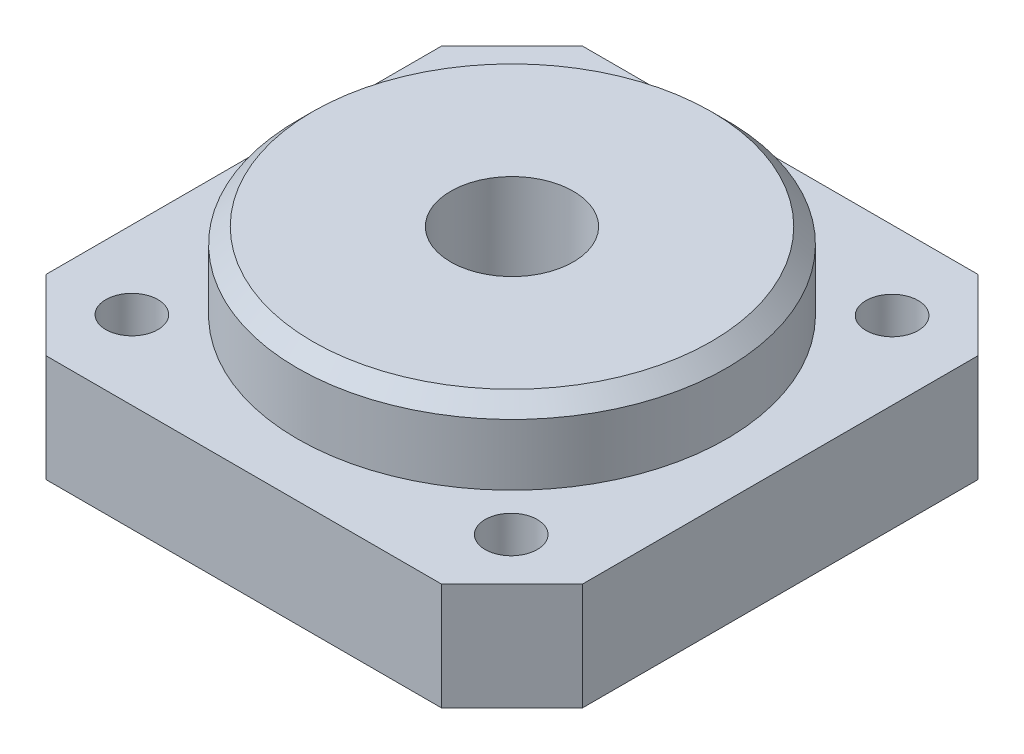
ISO-10303-21;
HEADER;
FILE_DESCRIPTION(('STEP AP214'),'2;1');
FILE_NAME('part.step','',(''),(''),'','','');
FILE_SCHEMA(('AUTOMOTIVE_DESIGN { 1 0 10303 214 1 1 1 1 }'));
ENDSEC;
DATA;
#1=APPLICATION_CONTEXT('core data for automotive mechanical design processes');
#2=APPLICATION_PROTOCOL_DEFINITION('international standard','automotive_design',2000,#1);
#3=PRODUCT_CONTEXT('',#1,'mechanical');
#4=PRODUCT('Part','Part','',(#3));
#5=PRODUCT_RELATED_PRODUCT_CATEGORY('part','',(#4));
#6=PRODUCT_DEFINITION_FORMATION('','',#4);
#7=PRODUCT_DEFINITION_CONTEXT('part definition',#1,'design');
#8=PRODUCT_DEFINITION('design','',#6,#7);
#9=PRODUCT_DEFINITION_SHAPE('','',#8);
#10=(LENGTH_UNIT() NAMED_UNIT(*) SI_UNIT(.MILLI.,.METRE.));
#11=(NAMED_UNIT(*) PLANE_ANGLE_UNIT() SI_UNIT($,.RADIAN.));
#12=(NAMED_UNIT(*) SI_UNIT($,.STERADIAN.) SOLID_ANGLE_UNIT());
#13=UNCERTAINTY_MEASURE_WITH_UNIT(LENGTH_MEASURE(1.E-05),#10,'distance_accuracy_value','');
#14=(GEOMETRIC_REPRESENTATION_CONTEXT(3) GLOBAL_UNCERTAINTY_ASSIGNED_CONTEXT((#13)) GLOBAL_UNIT_ASSIGNED_CONTEXT((#10,
#11,#12)) REPRESENTATION_CONTEXT('',''));
#15=CARTESIAN_POINT('',(0.,0.,0.));
#16=DIRECTION('',(0.,0.,1.));
#17=DIRECTION('',(1.,0.,0.));
#18=AXIS2_PLACEMENT_3D('',#15,#16,#17);
#19=CARTESIAN_POINT('',(12.4269184653541,7.,-12.3743686707646));
#20=DIRECTION('',(0.,-1.,0.));
#21=DIRECTION('',(0.,0.,-1.));
#22=AXIS2_PLACEMENT_3D('',#19,#20,#21);
#23=CYLINDRICAL_SURFACE('',#22,1.7);
#24=CARTESIAN_POINT('',(12.4269184653541,7.,-12.3743686707646));
#25=DIRECTION('',(0.,1.,0.));
#26=DIRECTION('',(0.,0.,1.));
#27=AXIS2_PLACEMENT_3D('',#24,#25,#26);
#28=CIRCLE('',#27,1.7);
#29=CARTESIAN_POINT('',(12.4269184653541,7.,-10.6743686707646));
#30=VERTEX_POINT('',#29);
#31=EDGE_CURVE('E140',#30,#30,#28,.T.);
#32=ORIENTED_EDGE('',*,*,#31,.T.);
#33=EDGE_LOOP('',(#32));
#34=FACE_BOUND('',#33,.T.);
#35=CARTESIAN_POINT('',(12.4269184653541,4.,-12.3743686707646));
#36=DIRECTION('',(0.,-1.,0.));
#37=DIRECTION('',(0.,0.,-1.));
#38=AXIS2_PLACEMENT_3D('',#35,#36,#37);
#39=CIRCLE('',#38,1.7);
#40=CARTESIAN_POINT('',(12.4269184653541,4.,-14.0743686707646));
#41=VERTEX_POINT('',#40);
#42=EDGE_CURVE('E177',#41,#41,#39,.T.);
#43=ORIENTED_EDGE('',*,*,#42,.T.);
#44=EDGE_LOOP('',(#43));
#45=FACE_BOUND('',#44,.T.);
#46=ADVANCED_FACE('F33',(#34,#45),#23,.F.);
#47=CARTESIAN_POINT('',(12.3743686707646,7.,12.4269184653541));
#48=DIRECTION('',(0.,-1.,0.));
#49=DIRECTION('',(0.,0.,-1.));
#50=AXIS2_PLACEMENT_3D('',#47,#48,#49);
#51=CYLINDRICAL_SURFACE('',#50,1.70000000000002);
#52=CARTESIAN_POINT('',(12.3743686707646,7.,12.4269184653541));
#53=DIRECTION('',(0.,1.,0.));
#54=DIRECTION('',(0.,0.,1.));
#55=AXIS2_PLACEMENT_3D('',#52,#53,#54);
#56=CIRCLE('',#55,1.70000000000002);
#57=CARTESIAN_POINT('',(12.3743686707646,7.,14.1269184653541));
#58=VERTEX_POINT('',#57);
#59=EDGE_CURVE('E197',#58,#58,#56,.T.);
#60=ORIENTED_EDGE('',*,*,#59,.T.);
#61=EDGE_LOOP('',(#60));
#62=FACE_BOUND('',#61,.T.);
#63=CARTESIAN_POINT('',(12.3743686707646,4.,12.4269184653541));
#64=DIRECTION('',(0.,-1.,0.));
#65=DIRECTION('',(0.,0.,-1.));
#66=AXIS2_PLACEMENT_3D('',#63,#64,#65);
#67=CIRCLE('',#66,1.70000000000002);
#68=CARTESIAN_POINT('',(12.3743686707646,4.,10.7269184653541));
#69=VERTEX_POINT('',#68);
#70=EDGE_CURVE('E174',#69,#69,#67,.T.);
#71=ORIENTED_EDGE('',*,*,#70,.T.);
#72=EDGE_LOOP('',(#71));
#73=FACE_BOUND('',#72,.T.);
#74=ADVANCED_FACE('F233',(#62,#73),#51,.F.);
#75=CARTESIAN_POINT('',(-12.4269184653541,7.,12.3743686707646));
#76=DIRECTION('',(0.,-1.,0.));
#77=DIRECTION('',(0.,0.,-1.));
#78=AXIS2_PLACEMENT_3D('',#75,#76,#77);
#79=CYLINDRICAL_SURFACE('',#78,1.70000000000005);
#80=CARTESIAN_POINT('',(-12.4269184653541,7.,12.3743686707646));
#81=DIRECTION('',(0.,1.,0.));
#82=DIRECTION('',(0.,0.,1.));
#83=AXIS2_PLACEMENT_3D('',#80,#81,#82);
#84=CIRCLE('',#83,1.70000000000005);
#85=CARTESIAN_POINT('',(-12.4269184653541,7.,14.0743686707646));
#86=VERTEX_POINT('',#85);
#87=EDGE_CURVE('E193',#86,#86,#84,.T.);
#88=ORIENTED_EDGE('',*,*,#87,.T.);
#89=EDGE_LOOP('',(#88));
#90=FACE_BOUND('',#89,.T.);
#91=CARTESIAN_POINT('',(-12.4269184653541,4.,12.3743686707646));
#92=DIRECTION('',(0.,-1.,0.));
#93=DIRECTION('',(0.,0.,-1.));
#94=AXIS2_PLACEMENT_3D('',#91,#92,#93);
#95=CIRCLE('',#94,1.70000000000005);
#96=CARTESIAN_POINT('',(-12.4269184653541,4.,10.6743686707645));
#97=VERTEX_POINT('',#96);
#98=EDGE_CURVE('E170',#97,#97,#95,.T.);
#99=ORIENTED_EDGE('',*,*,#98,.T.);
#100=EDGE_LOOP('',(#99));
#101=FACE_BOUND('',#100,.T.);
#102=ADVANCED_FACE('F239',(#90,#101),#79,.F.);
#103=CARTESIAN_POINT('',(-12.3743686707646,7.,-12.4269184653541));
#104=DIRECTION('',(0.,-1.,0.));
#105=DIRECTION('',(0.,0.,-1.));
#106=AXIS2_PLACEMENT_3D('',#103,#104,#105);
#107=CYLINDRICAL_SURFACE('',#106,1.70000000000009);
#108=CARTESIAN_POINT('',(-12.3743686707646,7.,-12.4269184653541));
#109=DIRECTION('',(0.,1.,0.));
#110=DIRECTION('',(0.,0.,1.));
#111=AXIS2_PLACEMENT_3D('',#108,#109,#110);
#112=CIRCLE('',#111,1.70000000000009);
#113=CARTESIAN_POINT('',(-12.3743686707646,7.,-10.726918465354));
#114=VERTEX_POINT('',#113);
#115=EDGE_CURVE('E190',#114,#114,#112,.T.);
#116=ORIENTED_EDGE('',*,*,#115,.T.);
#117=EDGE_LOOP('',(#116));
#118=FACE_BOUND('',#117,.T.);
#119=CARTESIAN_POINT('',(-12.3743686707646,4.,-12.4269184653541));
#120=DIRECTION('',(0.,-1.,0.));
#121=DIRECTION('',(0.,0.,-1.));
#122=AXIS2_PLACEMENT_3D('',#119,#120,#121);
#123=CIRCLE('',#122,1.70000000000009);
#124=CARTESIAN_POINT('',(-12.3743686707646,4.,-14.1269184653542));
#125=VERTEX_POINT('',#124);
#126=EDGE_CURVE('E167',#125,#125,#123,.T.);
#127=ORIENTED_EDGE('',*,*,#126,.T.);
#128=EDGE_LOOP('',(#127));
#129=FACE_BOUND('',#128,.T.);
#130=ADVANCED_FACE('F247',(#118,#129),#107,.F.);
#131=CARTESIAN_POINT('',(0.,7.,0.));
#132=DIRECTION('',(0.,-1.,0.));
#133=DIRECTION('',(0.,0.,-1.));
#134=AXIS2_PLACEMENT_3D('',#131,#132,#133);
#135=PLANE('',#134);
#136=CARTESIAN_POINT('',(0.,7.,0.));
#137=DIRECTION('',(0.,1.,0.));
#138=DIRECTION('',(0.,0.,1.));
#139=AXIS2_PLACEMENT_3D('',#136,#137,#138);
#140=CIRCLE('',#139,14.);
#141=CARTESIAN_POINT('',(0.,7.,14.));
#142=VERTEX_POINT('',#141);
#143=EDGE_CURVE('E166',#142,#142,#140,.T.);
#144=ORIENTED_EDGE('',*,*,#143,.F.);
#145=EDGE_LOOP('',(#144));
#146=FACE_BOUND('',#145,.T.);
#147=DIRECTION('',(-1.,0.,0.));
#148=VECTOR('',#147,1.);
#149=CARTESIAN_POINT('',(-12.9055915910216,7.,-17.5));
#150=LINE('',#149,#148);
#151=CARTESIAN_POINT('',(12.9055915910215,7.,-17.5));
#152=VERTEX_POINT('',#151);
#153=CARTESIAN_POINT('',(-12.9055915910216,7.,-17.5));
#154=VERTEX_POINT('',#153);
#155=EDGE_CURVE('E50',#152,#154,#150,.T.);
#156=ORIENTED_EDGE('',*,*,#155,.T.);
#157=DIRECTION('',(-0.707106781186546,0.,0.707106781186549));
#158=VECTOR('',#157,1.);
#159=CARTESIAN_POINT('',(-17.5,7.,-12.9055915910215));
#160=LINE('',#159,#158);
#161=CARTESIAN_POINT('',(-17.5,7.,-12.9055915910215));
#162=VERTEX_POINT('',#161);
#163=EDGE_CURVE('E94',#154,#162,#160,.T.);
#164=ORIENTED_EDGE('',*,*,#163,.T.);
#165=DIRECTION('',(0.,0.,1.));
#166=VECTOR('',#165,1.);
#167=CARTESIAN_POINT('',(-17.5,7.,0.));
#168=LINE('',#167,#166);
#169=CARTESIAN_POINT('',(-17.5,7.,12.9055915910216));
#170=VERTEX_POINT('',#169);
#171=EDGE_CURVE('E204',#162,#170,#168,.T.);
#172=ORIENTED_EDGE('',*,*,#171,.T.);
#173=DIRECTION('',(0.707106781186549,0.,0.707106781186546));
#174=VECTOR('',#173,1.);
#175=CARTESIAN_POINT('',(-12.9055915910215,7.,17.5));
#176=LINE('',#175,#174);
#177=CARTESIAN_POINT('',(-12.9055915910215,7.,17.5));
#178=VERTEX_POINT('',#177);
#179=EDGE_CURVE('E206',#170,#178,#176,.T.);
#180=ORIENTED_EDGE('',*,*,#179,.T.);
#181=DIRECTION('',(1.,0.,0.));
#182=VECTOR('',#181,1.);
#183=CARTESIAN_POINT('',(0.,7.,17.5));
#184=LINE('',#183,#182);
#185=CARTESIAN_POINT('',(12.9055915910216,7.,17.5));
#186=VERTEX_POINT('',#185);
#187=EDGE_CURVE('E115',#178,#186,#184,.T.);
#188=ORIENTED_EDGE('',*,*,#187,.T.);
#189=DIRECTION('',(0.707106781186546,0.,-0.707106781186549));
#190=VECTOR('',#189,1.);
#191=CARTESIAN_POINT('',(17.5,7.,12.9055915910215));
#192=LINE('',#191,#190);
#193=CARTESIAN_POINT('',(17.5,7.,12.9055915910215));
#194=VERTEX_POINT('',#193);
#195=EDGE_CURVE('E108',#186,#194,#192,.T.);
#196=ORIENTED_EDGE('',*,*,#195,.T.);
#197=DIRECTION('',(0.,0.,-1.));
#198=VECTOR('',#197,1.);
#199=CARTESIAN_POINT('',(17.5,7.,0.));
#200=LINE('',#199,#198);
#201=CARTESIAN_POINT('',(17.5,7.,-12.9055915910215));
#202=VERTEX_POINT('',#201);
#203=EDGE_CURVE('E113',#194,#202,#200,.T.);
#204=ORIENTED_EDGE('',*,*,#203,.T.);
#205=DIRECTION('',(-0.707106781186549,0.,-0.707106781186546));
#206=VECTOR('',#205,1.);
#207=CARTESIAN_POINT('',(12.9055915910215,7.,-17.5));
#208=LINE('',#207,#206);
#209=EDGE_CURVE('E130',#202,#152,#208,.T.);
#210=ORIENTED_EDGE('',*,*,#209,.T.);
#211=EDGE_LOOP('',(#156,#164,#172,#180,#188,#196,#204,#210));
#212=FACE_BOUND('',#211,.T.);
#213=ORIENTED_EDGE('',*,*,#31,.F.);
#214=EDGE_LOOP('',(#213));
#215=FACE_BOUND('',#214,.T.);
#216=ORIENTED_EDGE('',*,*,#59,.F.);
#217=EDGE_LOOP('',(#216));
#218=FACE_BOUND('',#217,.T.);
#219=ORIENTED_EDGE('',*,*,#87,.F.);
#220=EDGE_LOOP('',(#219));
#221=FACE_BOUND('',#220,.T.);
#222=ORIENTED_EDGE('',*,*,#115,.F.);
#223=EDGE_LOOP('',(#222));
#224=FACE_BOUND('',#223,.T.);
#225=ADVANCED_FACE('F110',(#146,#212,#215,#218,#221,#224),#135,.F.);
#226=CARTESIAN_POINT('',(0.,0.,0.));
#227=DIRECTION('',(0.,-1.,0.));
#228=DIRECTION('',(0.,0.,-1.));
#229=AXIS2_PLACEMENT_3D('',#226,#227,#228);
#230=PLANE('',#229);
#231=CARTESIAN_POINT('',(-12.3743686707639,0.,-12.4269184653541));
#232=DIRECTION('',(0.,-1.,0.));
#233=DIRECTION('',(0.,0.,-1.));
#234=AXIS2_PLACEMENT_3D('',#231,#232,#233);
#235=CIRCLE('',#234,3.25000000000037);
#236=CARTESIAN_POINT('',(-12.3743686707639,0.,-15.6769184653544));
#237=VERTEX_POINT('',#236);
#238=EDGE_CURVE('E483',#237,#237,#235,.T.);
#239=ORIENTED_EDGE('',*,*,#238,.F.);
#240=EDGE_LOOP('',(#239));
#241=FACE_BOUND('',#240,.T.);
#242=CARTESIAN_POINT('',(12.4269184653548,0.,-12.3743686707639));
#243=DIRECTION('',(0.,-1.,0.));
#244=DIRECTION('',(0.,0.,-1.));
#245=AXIS2_PLACEMENT_3D('',#242,#243,#244);
#246=CIRCLE('',#245,3.250000000001);
#247=CARTESIAN_POINT('',(12.4269184653548,0.,-15.6243686707649));
#248=VERTEX_POINT('',#247);
#249=EDGE_CURVE('E482',#248,#248,#246,.T.);
#250=ORIENTED_EDGE('',*,*,#249,.F.);
#251=EDGE_LOOP('',(#250));
#252=FACE_BOUND('',#251,.T.);
#253=CARTESIAN_POINT('',(12.3743686707646,0.,12.4269184653548));
#254=DIRECTION('',(0.,-1.,0.));
#255=DIRECTION('',(0.,0.,-1.));
#256=AXIS2_PLACEMENT_3D('',#253,#254,#255);
#257=CIRCLE('',#256,3.25000000000073);
#258=CARTESIAN_POINT('',(12.3743686707646,0.,9.17691846535405));
#259=VERTEX_POINT('',#258);
#260=EDGE_CURVE('E507',#259,#259,#257,.T.);
#261=ORIENTED_EDGE('',*,*,#260,.F.);
#262=EDGE_LOOP('',(#261));
#263=FACE_BOUND('',#262,.T.);
#264=CARTESIAN_POINT('',(-12.4269184653541,0.,12.3743686707646));
#265=DIRECTION('',(0.,-1.,0.));
#266=DIRECTION('',(0.,0.,-1.));
#267=AXIS2_PLACEMENT_3D('',#264,#265,#266);
#268=CIRCLE('',#267,3.25);
#269=CARTESIAN_POINT('',(-12.4269184653541,0.,9.12436867076459));
#270=VERTEX_POINT('',#269);
#271=EDGE_CURVE('E494',#270,#270,#268,.T.);
#272=ORIENTED_EDGE('',*,*,#271,.F.);
#273=EDGE_LOOP('',(#272));
#274=FACE_BOUND('',#273,.T.);
#275=CARTESIAN_POINT('',(0.,0.,0.));
#276=DIRECTION('',(0.,-1.,0.));
#277=DIRECTION('',(0.,0.,-1.));
#278=AXIS2_PLACEMENT_3D('',#275,#276,#277);
#279=CIRCLE('',#278,4.);
#280=CARTESIAN_POINT('',(0.,0.,-4.));
#281=VERTEX_POINT('',#280);
#282=EDGE_CURVE('E179',#281,#281,#279,.F.);
#283=ORIENTED_EDGE('',*,*,#282,.T.);
#284=EDGE_LOOP('',(#283));
#285=FACE_BOUND('',#284,.T.);
#286=DIRECTION('',(-0.707106781186546,0.,0.707106781186549));
#287=VECTOR('',#286,1.);
#288=CARTESIAN_POINT('',(-17.5,0.,-12.9055915910215));
#289=LINE('',#288,#287);
#290=CARTESIAN_POINT('',(-12.9055915910216,0.,-17.5));
#291=VERTEX_POINT('',#290);
#292=CARTESIAN_POINT('',(-17.5,0.,-12.9055915910215));
#293=VERTEX_POINT('',#292);
#294=EDGE_CURVE('E136',#291,#293,#289,.T.);
#295=ORIENTED_EDGE('',*,*,#294,.F.);
#296=DIRECTION('',(-1.,0.,0.));
#297=VECTOR('',#296,1.);
#298=CARTESIAN_POINT('',(0.,0.,-17.5));
#299=LINE('',#298,#297);
#300=CARTESIAN_POINT('',(12.9055915910215,0.,-17.5));
#301=VERTEX_POINT('',#300);
#302=EDGE_CURVE('E150',#301,#291,#299,.T.);
#303=ORIENTED_EDGE('',*,*,#302,.F.);
#304=DIRECTION('',(-0.707106781186549,0.,-0.707106781186546));
#305=VECTOR('',#304,1.);
#306=CARTESIAN_POINT('',(12.9055915910215,0.,-17.5));
#307=LINE('',#306,#305);
#308=CARTESIAN_POINT('',(17.5,0.,-12.9055915910215));
#309=VERTEX_POINT('',#308);
#310=EDGE_CURVE('E86',#309,#301,#307,.T.);
#311=ORIENTED_EDGE('',*,*,#310,.F.);
#312=DIRECTION('',(0.,0.,-1.));
#313=VECTOR('',#312,1.);
#314=CARTESIAN_POINT('',(17.5,0.,-12.9055915910215));
#315=LINE('',#314,#313);
#316=CARTESIAN_POINT('',(17.5,0.,12.9055915910215));
#317=VERTEX_POINT('',#316);
#318=EDGE_CURVE('E79',#317,#309,#315,.T.);
#319=ORIENTED_EDGE('',*,*,#318,.F.);
#320=DIRECTION('',(0.707106781186546,0.,-0.707106781186549));
#321=VECTOR('',#320,1.);
#322=CARTESIAN_POINT('',(17.5,0.,12.9055915910215));
#323=LINE('',#322,#321);
#324=CARTESIAN_POINT('',(12.9055915910216,0.,17.5));
#325=VERTEX_POINT('',#324);
#326=EDGE_CURVE('E124',#325,#317,#323,.T.);
#327=ORIENTED_EDGE('',*,*,#326,.F.);
#328=DIRECTION('',(1.,0.,0.));
#329=VECTOR('',#328,1.);
#330=CARTESIAN_POINT('',(12.9055915910216,0.,17.5));
#331=LINE('',#330,#329);
#332=CARTESIAN_POINT('',(-12.9055915910215,0.,17.5));
#333=VERTEX_POINT('',#332);
#334=EDGE_CURVE('E145',#333,#325,#331,.T.);
#335=ORIENTED_EDGE('',*,*,#334,.F.);
#336=DIRECTION('',(0.707106781186549,0.,0.707106781186546));
#337=VECTOR('',#336,1.);
#338=CARTESIAN_POINT('',(-12.9055915910215,0.,17.5));
#339=LINE('',#338,#337);
#340=CARTESIAN_POINT('',(-17.5,0.,12.9055915910216));
#341=VERTEX_POINT('',#340);
#342=EDGE_CURVE('E142',#341,#333,#339,.T.);
#343=ORIENTED_EDGE('',*,*,#342,.F.);
#344=DIRECTION('',(0.,0.,1.));
#345=VECTOR('',#344,1.);
#346=CARTESIAN_POINT('',(-17.5,0.,12.9055915910216));
#347=LINE('',#346,#345);
#348=EDGE_CURVE('E139',#293,#341,#347,.T.);
#349=ORIENTED_EDGE('',*,*,#348,.F.);
#350=EDGE_LOOP('',(#295,#303,#311,#319,#327,#335,#343,#349));
#351=FACE_BOUND('',#350,.T.);
#352=ADVANCED_FACE('F218',(#241,#252,#263,#274,#285,#351),#230,.T.);
#353=CARTESIAN_POINT('',(-17.5,7.,-12.9055915910215));
#354=DIRECTION('',(0.707106781186549,0.,0.707106781186546));
#355=DIRECTION('',(0.707106781186546,0.,-0.707106781186549));
#356=AXIS2_PLACEMENT_3D('',#353,#354,#355);
#357=PLANE('',#356);
#358=ORIENTED_EDGE('',*,*,#294,.T.);
#359=DIRECTION('',(0.,-1.,0.));
#360=VECTOR('',#359,1.);
#361=CARTESIAN_POINT('',(-17.5,7.,-12.9055915910215));
#362=LINE('',#361,#360);
#363=EDGE_CURVE('E161',#162,#293,#362,.T.);
#364=ORIENTED_EDGE('',*,*,#363,.F.);
#365=ORIENTED_EDGE('',*,*,#163,.F.);
#366=DIRECTION('',(0.,-1.,0.));
#367=VECTOR('',#366,1.);
#368=CARTESIAN_POINT('',(-12.9055915910216,7.,-17.5));
#369=LINE('',#368,#367);
#370=EDGE_CURVE('E164',#154,#291,#369,.T.);
#371=ORIENTED_EDGE('',*,*,#370,.T.);
#372=EDGE_LOOP('',(#358,#364,#365,#371));
#373=FACE_BOUND('',#372,.T.);
#374=ADVANCED_FACE('F222',(#373),#357,.F.);
#375=CARTESIAN_POINT('',(-17.5,7.,12.9055915910216));
#376=DIRECTION('',(1.,0.,0.));
#377=DIRECTION('',(0.,0.,-1.));
#378=AXIS2_PLACEMENT_3D('',#375,#376,#377);
#379=PLANE('',#378);
#380=ORIENTED_EDGE('',*,*,#348,.T.);
#381=DIRECTION('',(0.,-1.,0.));
#382=VECTOR('',#381,1.);
#383=CARTESIAN_POINT('',(-17.5,7.,12.9055915910216));
#384=LINE('',#383,#382);
#385=EDGE_CURVE('E158',#170,#341,#384,.T.);
#386=ORIENTED_EDGE('',*,*,#385,.F.);
#387=ORIENTED_EDGE('',*,*,#171,.F.);
#388=ORIENTED_EDGE('',*,*,#363,.T.);
#389=EDGE_LOOP('',(#380,#386,#387,#388));
#390=FACE_BOUND('',#389,.T.);
#391=ADVANCED_FACE('F224',(#390),#379,.F.);
#392=CARTESIAN_POINT('',(-12.9055915910215,7.,17.5));
#393=DIRECTION('',(0.707106781186546,0.,-0.707106781186549));
#394=DIRECTION('',(-0.707106781186549,0.,-0.707106781186546));
#395=AXIS2_PLACEMENT_3D('',#392,#393,#394);
#396=PLANE('',#395);
#397=ORIENTED_EDGE('',*,*,#342,.T.);
#398=DIRECTION('',(0.,-1.,0.));
#399=VECTOR('',#398,1.);
#400=CARTESIAN_POINT('',(-12.9055915910215,7.,17.5));
#401=LINE('',#400,#399);
#402=EDGE_CURVE('E155',#178,#333,#401,.T.);
#403=ORIENTED_EDGE('',*,*,#402,.F.);
#404=ORIENTED_EDGE('',*,*,#179,.F.);
#405=ORIENTED_EDGE('',*,*,#385,.T.);
#406=EDGE_LOOP('',(#397,#403,#404,#405));
#407=FACE_BOUND('',#406,.T.);
#408=ADVANCED_FACE('F212',(#407),#396,.F.);
#409=CARTESIAN_POINT('',(12.9055915910216,7.,17.5));
#410=DIRECTION('',(0.,0.,-1.));
#411=DIRECTION('',(-1.,0.,0.));
#412=AXIS2_PLACEMENT_3D('',#409,#410,#411);
#413=PLANE('',#412);
#414=ORIENTED_EDGE('',*,*,#334,.T.);
#415=DIRECTION('',(0.,-1.,0.));
#416=VECTOR('',#415,1.);
#417=CARTESIAN_POINT('',(12.9055915910216,7.,17.5));
#418=LINE('',#417,#416);
#419=EDGE_CURVE('E125',#186,#325,#418,.T.);
#420=ORIENTED_EDGE('',*,*,#419,.F.);
#421=ORIENTED_EDGE('',*,*,#187,.F.);
#422=ORIENTED_EDGE('',*,*,#402,.T.);
#423=EDGE_LOOP('',(#414,#420,#421,#422));
#424=FACE_BOUND('',#423,.T.);
#425=ADVANCED_FACE('F215',(#424),#413,.F.);
#426=CARTESIAN_POINT('',(17.5,7.,12.9055915910215));
#427=DIRECTION('',(-0.707106781186549,0.,-0.707106781186546));
#428=DIRECTION('',(-0.707106781186546,0.,0.707106781186549));
#429=AXIS2_PLACEMENT_3D('',#426,#427,#428);
#430=PLANE('',#429);
#431=ORIENTED_EDGE('',*,*,#326,.T.);
#432=DIRECTION('',(0.,-1.,0.));
#433=VECTOR('',#432,1.);
#434=CARTESIAN_POINT('',(17.5,7.,12.9055915910215));
#435=LINE('',#434,#433);
#436=EDGE_CURVE('E121',#194,#317,#435,.T.);
#437=ORIENTED_EDGE('',*,*,#436,.F.);
#438=ORIENTED_EDGE('',*,*,#195,.F.);
#439=ORIENTED_EDGE('',*,*,#419,.T.);
#440=EDGE_LOOP('',(#431,#437,#438,#439));
#441=FACE_BOUND('',#440,.T.);
#442=ADVANCED_FACE('F122',(#441),#430,.F.);
#443=CARTESIAN_POINT('',(17.5,7.,-12.9055915910215));
#444=DIRECTION('',(-1.,0.,0.));
#445=DIRECTION('',(0.,0.,1.));
#446=AXIS2_PLACEMENT_3D('',#443,#444,#445);
#447=PLANE('',#446);
#448=ORIENTED_EDGE('',*,*,#318,.T.);
#449=DIRECTION('',(0.,-1.,0.));
#450=VECTOR('',#449,1.);
#451=CARTESIAN_POINT('',(17.5,7.,-12.9055915910215));
#452=LINE('',#451,#450);
#453=EDGE_CURVE('E126',#202,#309,#452,.T.);
#454=ORIENTED_EDGE('',*,*,#453,.F.);
#455=ORIENTED_EDGE('',*,*,#203,.F.);
#456=ORIENTED_EDGE('',*,*,#436,.T.);
#457=EDGE_LOOP('',(#448,#454,#455,#456));
#458=FACE_BOUND('',#457,.T.);
#459=ADVANCED_FACE('F128',(#458),#447,.F.);
#460=CARTESIAN_POINT('',(12.9055915910215,7.,-17.5));
#461=DIRECTION('',(-0.707106781186546,0.,0.707106781186549));
#462=DIRECTION('',(0.707106781186549,0.,0.707106781186546));
#463=AXIS2_PLACEMENT_3D('',#460,#461,#462);
#464=PLANE('',#463);
#465=ORIENTED_EDGE('',*,*,#310,.T.);
#466=DIRECTION('',(0.,-1.,0.));
#467=VECTOR('',#466,1.);
#468=CARTESIAN_POINT('',(12.9055915910215,7.,-17.5));
#469=LINE('',#468,#467);
#470=EDGE_CURVE('E132',#152,#301,#469,.T.);
#471=ORIENTED_EDGE('',*,*,#470,.F.);
#472=ORIENTED_EDGE('',*,*,#209,.F.);
#473=ORIENTED_EDGE('',*,*,#453,.T.);
#474=EDGE_LOOP('',(#465,#471,#472,#473));
#475=FACE_BOUND('',#474,.T.);
#476=ADVANCED_FACE('F221',(#475),#464,.F.);
#477=CARTESIAN_POINT('',(0.,7.,-17.5));
#478=DIRECTION('',(0.,0.,1.));
#479=DIRECTION('',(1.,0.,0.));
#480=AXIS2_PLACEMENT_3D('',#477,#478,#479);
#481=PLANE('',#480);
#482=ORIENTED_EDGE('',*,*,#302,.T.);
#483=ORIENTED_EDGE('',*,*,#370,.F.);
#484=ORIENTED_EDGE('',*,*,#155,.F.);
#485=ORIENTED_EDGE('',*,*,#470,.T.);
#486=EDGE_LOOP('',(#482,#483,#484,#485));
#487=FACE_BOUND('',#486,.T.);
#488=ADVANCED_FACE('F220',(#487),#481,.F.);
#489=CARTESIAN_POINT('',(0.,12.,0.));
#490=DIRECTION('',(0.,-1.,0.));
#491=DIRECTION('',(0.,0.,-1.));
#492=AXIS2_PLACEMENT_3D('',#489,#490,#491);
#493=CYLINDRICAL_SURFACE('',#492,14.);
#494=CARTESIAN_POINT('',(0.,11.,0.));
#495=DIRECTION('',(0.,1.,0.));
#496=DIRECTION('',(0.,0.,1.));
#497=AXIS2_PLACEMENT_3D('',#494,#495,#496);
#498=CIRCLE('',#497,14.);
#499=CARTESIAN_POINT('',(0.,11.,14.));
#500=VERTEX_POINT('',#499);
#501=EDGE_CURVE('E11',#500,#500,#498,.F.);
#502=ORIENTED_EDGE('',*,*,#501,.T.);
#503=EDGE_LOOP('',(#502));
#504=FACE_BOUND('',#503,.T.);
#505=ORIENTED_EDGE('',*,*,#143,.T.);
#506=EDGE_LOOP('',(#505));
#507=FACE_BOUND('',#506,.T.);
#508=ADVANCED_FACE('F254',(#504,#507),#493,.T.);
#509=CARTESIAN_POINT('',(0.,12.,0.));
#510=DIRECTION('',(0.,1.,0.));
#511=DIRECTION('',(0.,0.,1.));
#512=AXIS2_PLACEMENT_3D('',#509,#510,#511);
#513=PLANE('',#512);
#514=CARTESIAN_POINT('',(0.,12.,0.));
#515=DIRECTION('',(0.,1.,0.));
#516=DIRECTION('',(0.,0.,1.));
#517=AXIS2_PLACEMENT_3D('',#514,#515,#516);
#518=CIRCLE('',#517,13.);
#519=CARTESIAN_POINT('',(0.,12.,13.));
#520=VERTEX_POINT('',#519);
#521=EDGE_CURVE('E42',#520,#520,#518,.T.);
#522=ORIENTED_EDGE('',*,*,#521,.T.);
#523=EDGE_LOOP('',(#522));
#524=FACE_BOUND('',#523,.T.);
#525=CARTESIAN_POINT('',(0.,12.,0.));
#526=DIRECTION('',(0.,1.,0.));
#527=DIRECTION('',(0.,0.,1.));
#528=AXIS2_PLACEMENT_3D('',#525,#526,#527);
#529=CIRCLE('',#528,4.);
#530=CARTESIAN_POINT('',(0.,12.,4.));
#531=VERTEX_POINT('',#530);
#532=EDGE_CURVE('E194',#531,#531,#529,.T.);
#533=ORIENTED_EDGE('',*,*,#532,.F.);
#534=EDGE_LOOP('',(#533));
#535=FACE_BOUND('',#534,.T.);
#536=ADVANCED_FACE('F289',(#524,#535),#513,.T.);
#537=CARTESIAN_POINT('',(0.,-0.000999999999999265,0.));
#538=DIRECTION('',(0.,1.,0.));
#539=DIRECTION('',(0.,0.,1.));
#540=AXIS2_PLACEMENT_3D('',#537,#538,#539);
#541=CYLINDRICAL_SURFACE('',#540,4.);
#542=ORIENTED_EDGE('',*,*,#282,.F.);
#543=EDGE_LOOP('',(#542));
#544=FACE_BOUND('',#543,.T.);
#545=ORIENTED_EDGE('',*,*,#532,.T.);
#546=EDGE_LOOP('',(#545));
#547=FACE_BOUND('',#546,.T.);
#548=ADVANCED_FACE('F298',(#544,#547),#541,.F.);
#549=CARTESIAN_POINT('',(-12.3743686707639,4.,-12.4269184653541));
#550=DIRECTION('',(0.,-1.,0.));
#551=DIRECTION('',(0.,0.,-1.));
#552=AXIS2_PLACEMENT_3D('',#549,#550,#551);
#553=CYLINDRICAL_SURFACE('',#552,3.25000000000037);
#554=CARTESIAN_POINT('',(-12.3743686707639,4.,-12.4269184653541));
#555=DIRECTION('',(0.,-1.,0.));
#556=DIRECTION('',(0.,0.,-1.));
#557=AXIS2_PLACEMENT_3D('',#554,#555,#556);
#558=CIRCLE('',#557,3.25000000000037);
#559=CARTESIAN_POINT('',(-12.3743686707639,4.,-15.6769184653544));
#560=VERTEX_POINT('',#559);
#561=EDGE_CURVE('E481',#560,#560,#558,.T.);
#562=ORIENTED_EDGE('',*,*,#561,.F.);
#563=EDGE_LOOP('',(#562));
#564=FACE_BOUND('',#563,.T.);
#565=ORIENTED_EDGE('',*,*,#238,.T.);
#566=EDGE_LOOP('',(#565));
#567=FACE_BOUND('',#566,.T.);
#568=ADVANCED_FACE('F306',(#564,#567),#553,.F.);
#569=CARTESIAN_POINT('',(-12.3743686707639,4.,-12.4269184653541));
#570=DIRECTION('',(0.,-1.,0.));
#571=DIRECTION('',(0.,0.,-1.));
#572=AXIS2_PLACEMENT_3D('',#569,#570,#571);
#573=PLANE('',#572);
#574=ORIENTED_EDGE('',*,*,#126,.F.);
#575=EDGE_LOOP('',(#574));
#576=FACE_BOUND('',#575,.T.);
#577=ORIENTED_EDGE('',*,*,#561,.T.);
#578=EDGE_LOOP('',(#577));
#579=FACE_BOUND('',#578,.T.);
#580=ADVANCED_FACE('F314',(#576,#579),#573,.T.);
#581=CARTESIAN_POINT('',(-12.4269184653541,4.,12.3743686707646));
#582=DIRECTION('',(0.,-1.,0.));
#583=DIRECTION('',(0.,0.,-1.));
#584=AXIS2_PLACEMENT_3D('',#581,#582,#583);
#585=CYLINDRICAL_SURFACE('',#584,3.25);
#586=CARTESIAN_POINT('',(-12.4269184653541,4.,12.3743686707646));
#587=DIRECTION('',(0.,-1.,0.));
#588=DIRECTION('',(0.,0.,-1.));
#589=AXIS2_PLACEMENT_3D('',#586,#587,#588);
#590=CIRCLE('',#589,3.25);
#591=CARTESIAN_POINT('',(-12.4269184653541,4.,9.12436867076459));
#592=VERTEX_POINT('',#591);
#593=EDGE_CURVE('E171',#592,#592,#590,.T.);
#594=ORIENTED_EDGE('',*,*,#593,.F.);
#595=EDGE_LOOP('',(#594));
#596=FACE_BOUND('',#595,.T.);
#597=ORIENTED_EDGE('',*,*,#271,.T.);
#598=EDGE_LOOP('',(#597));
#599=FACE_BOUND('',#598,.T.);
#600=ADVANCED_FACE('F323',(#596,#599),#585,.F.);
#601=CARTESIAN_POINT('',(-12.4269184653541,4.,12.3743686707646));
#602=DIRECTION('',(0.,-1.,0.));
#603=DIRECTION('',(0.,0.,-1.));
#604=AXIS2_PLACEMENT_3D('',#601,#602,#603);
#605=PLANE('',#604);
#606=ORIENTED_EDGE('',*,*,#98,.F.);
#607=EDGE_LOOP('',(#606));
#608=FACE_BOUND('',#607,.T.);
#609=ORIENTED_EDGE('',*,*,#593,.T.);
#610=EDGE_LOOP('',(#609));
#611=FACE_BOUND('',#610,.T.);
#612=ADVANCED_FACE('F331',(#608,#611),#605,.T.);
#613=CARTESIAN_POINT('',(12.3743686707646,4.,12.4269184653548));
#614=DIRECTION('',(0.,-1.,0.));
#615=DIRECTION('',(0.,0.,-1.));
#616=AXIS2_PLACEMENT_3D('',#613,#614,#615);
#617=CYLINDRICAL_SURFACE('',#616,3.25000000000073);
#618=CARTESIAN_POINT('',(12.3743686707646,4.,12.4269184653548));
#619=DIRECTION('',(0.,-1.,0.));
#620=DIRECTION('',(0.,0.,-1.));
#621=AXIS2_PLACEMENT_3D('',#618,#619,#620);
#622=CIRCLE('',#621,3.25000000000073);
#623=CARTESIAN_POINT('',(12.3743686707646,4.,9.17691846535405));
#624=VERTEX_POINT('',#623);
#625=EDGE_CURVE('E496',#624,#624,#622,.T.);
#626=ORIENTED_EDGE('',*,*,#625,.F.);
#627=EDGE_LOOP('',(#626));
#628=FACE_BOUND('',#627,.T.);
#629=ORIENTED_EDGE('',*,*,#260,.T.);
#630=EDGE_LOOP('',(#629));
#631=FACE_BOUND('',#630,.T.);
#632=ADVANCED_FACE('F339',(#628,#631),#617,.F.);
#633=CARTESIAN_POINT('',(12.3743686707646,4.,12.4269184653548));
#634=DIRECTION('',(0.,-1.,0.));
#635=DIRECTION('',(0.,0.,-1.));
#636=AXIS2_PLACEMENT_3D('',#633,#634,#635);
#637=PLANE('',#636);
#638=ORIENTED_EDGE('',*,*,#70,.F.);
#639=EDGE_LOOP('',(#638));
#640=FACE_BOUND('',#639,.T.);
#641=ORIENTED_EDGE('',*,*,#625,.T.);
#642=EDGE_LOOP('',(#641));
#643=FACE_BOUND('',#642,.T.);
#644=ADVANCED_FACE('F347',(#640,#643),#637,.T.);
#645=CARTESIAN_POINT('',(12.4269184653548,4.,-12.3743686707639));
#646=DIRECTION('',(0.,-1.,0.));
#647=DIRECTION('',(0.,0.,-1.));
#648=AXIS2_PLACEMENT_3D('',#645,#646,#647);
#649=CYLINDRICAL_SURFACE('',#648,3.250000000001);
#650=CARTESIAN_POINT('',(12.4269184653548,4.,-12.3743686707639));
#651=DIRECTION('',(0.,-1.,0.));
#652=DIRECTION('',(0.,0.,-1.));
#653=AXIS2_PLACEMENT_3D('',#650,#651,#652);
#654=CIRCLE('',#653,3.250000000001);
#655=CARTESIAN_POINT('',(12.4269184653548,4.,-15.6243686707649));
#656=VERTEX_POINT('',#655);
#657=EDGE_CURVE('E486',#656,#656,#654,.T.);
#658=ORIENTED_EDGE('',*,*,#657,.F.);
#659=EDGE_LOOP('',(#658));
#660=FACE_BOUND('',#659,.T.);
#661=ORIENTED_EDGE('',*,*,#249,.T.);
#662=EDGE_LOOP('',(#661));
#663=FACE_BOUND('',#662,.T.);
#664=ADVANCED_FACE('F355',(#660,#663),#649,.F.);
#665=CARTESIAN_POINT('',(12.4269184653548,4.,-12.3743686707639));
#666=DIRECTION('',(0.,-1.,0.));
#667=DIRECTION('',(0.,0.,-1.));
#668=AXIS2_PLACEMENT_3D('',#665,#666,#667);
#669=PLANE('',#668);
#670=ORIENTED_EDGE('',*,*,#42,.F.);
#671=EDGE_LOOP('',(#670));
#672=FACE_BOUND('',#671,.T.);
#673=ORIENTED_EDGE('',*,*,#657,.T.);
#674=EDGE_LOOP('',(#673));
#675=FACE_BOUND('',#674,.T.);
#676=ADVANCED_FACE('F363',(#672,#675),#669,.T.);
#677=CARTESIAN_POINT('',(0.,12.,0.));
#678=DIRECTION('',(0.,-1.,0.));
#679=DIRECTION('',(0.,0.,-1.));
#680=AXIS2_PLACEMENT_3D('',#677,#678,#679);
#681=CONICAL_SURFACE('',#680,13.,0.785398163397448);
#682=ORIENTED_EDGE('',*,*,#501,.F.);
#683=EDGE_LOOP('',(#682));
#684=FACE_BOUND('',#683,.T.);
#685=ORIENTED_EDGE('',*,*,#521,.F.);
#686=EDGE_LOOP('',(#685));
#687=FACE_BOUND('',#686,.T.);
#688=ADVANCED_FACE('F35',(#684,#687),#681,.T.);
#689=CLOSED_SHELL('',(#46,#74,#102,#130,#225,#352,#374,#391,#408,#425,#442,#459,#476,#488,#508,
#536,#548,#568,#580,#600,#612,#632,#644,#664,#676,#688));
#690=MANIFOLD_SOLID_BREP('B2',#689);
#691=ADVANCED_BREP_SHAPE_REPRESENTATION('',(#18,#690),#14);
#692=SHAPE_DEFINITION_REPRESENTATION(#9,#691);
ENDSEC;
END-ISO-10303-21;
